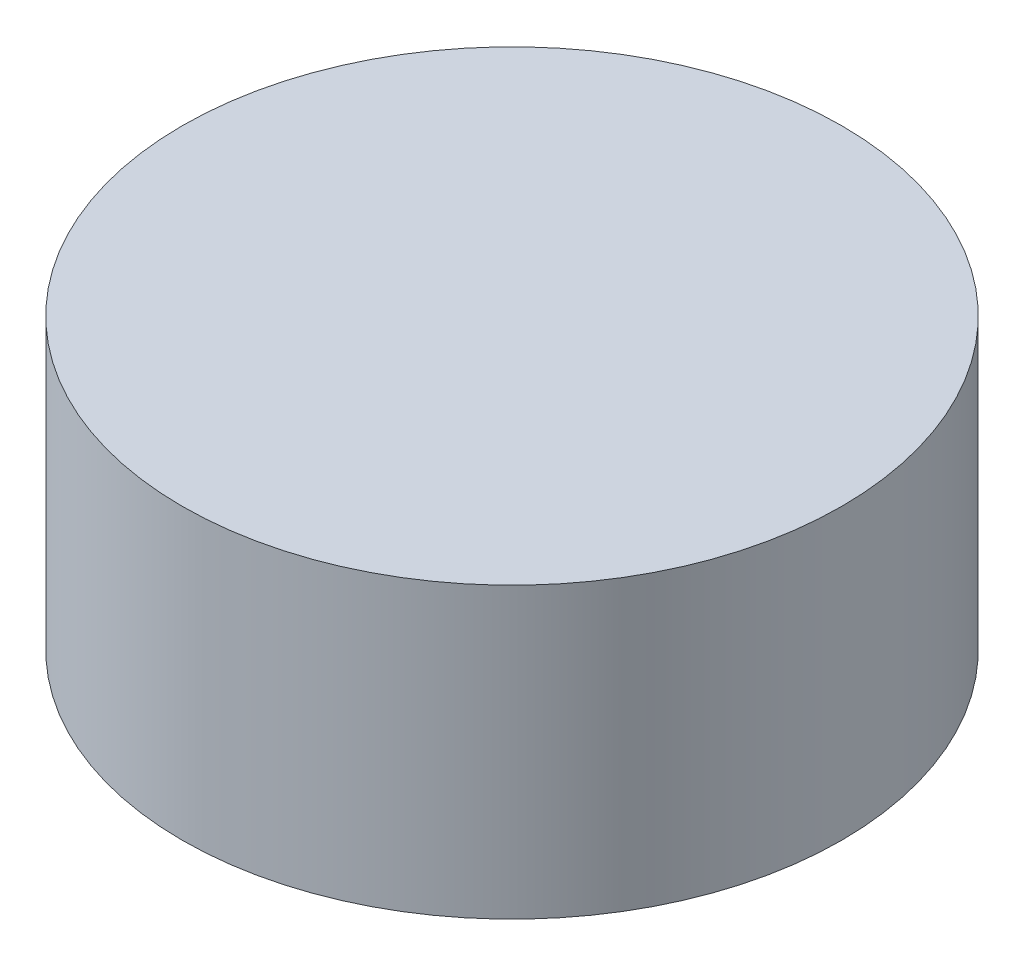
ISO-10303-21;
HEADER;
FILE_DESCRIPTION(('STEP AP214'),'2;1');
FILE_NAME('part.step','',(''),(''),'','','');
FILE_SCHEMA(('AUTOMOTIVE_DESIGN { 1 0 10303 214 1 1 1 1 }'));
ENDSEC;
DATA;
#1=APPLICATION_CONTEXT('core data for automotive mechanical design processes');
#2=APPLICATION_PROTOCOL_DEFINITION('international standard','automotive_design',2000,#1);
#3=PRODUCT_CONTEXT('',#1,'mechanical');
#4=PRODUCT('Part','Part','',(#3));
#5=PRODUCT_RELATED_PRODUCT_CATEGORY('part','',(#4));
#6=PRODUCT_DEFINITION_FORMATION('','',#4);
#7=PRODUCT_DEFINITION_CONTEXT('part definition',#1,'design');
#8=PRODUCT_DEFINITION('design','',#6,#7);
#9=PRODUCT_DEFINITION_SHAPE('','',#8);
#10=(LENGTH_UNIT() NAMED_UNIT(*) SI_UNIT(.MILLI.,.METRE.));
#11=(NAMED_UNIT(*) PLANE_ANGLE_UNIT() SI_UNIT($,.RADIAN.));
#12=(NAMED_UNIT(*) SI_UNIT($,.STERADIAN.) SOLID_ANGLE_UNIT());
#13=UNCERTAINTY_MEASURE_WITH_UNIT(LENGTH_MEASURE(1.E-05),#10,'distance_accuracy_value','');
#14=(GEOMETRIC_REPRESENTATION_CONTEXT(3) GLOBAL_UNCERTAINTY_ASSIGNED_CONTEXT((#13)) GLOBAL_UNIT_ASSIGNED_CONTEXT((#10,
#11,#12)) REPRESENTATION_CONTEXT('',''));
#15=CARTESIAN_POINT('',(0.,0.,0.));
#16=DIRECTION('',(0.,0.,1.));
#17=DIRECTION('',(1.,0.,0.));
#18=AXIS2_PLACEMENT_3D('',#15,#16,#17);
#19=CARTESIAN_POINT('',(0.,2.5,0.));
#20=DIRECTION('',(0.,-1.,0.));
#21=DIRECTION('',(0.,0.,-1.));
#22=AXIS2_PLACEMENT_3D('',#19,#20,#21);
#23=CYLINDRICAL_SURFACE('',#22,2.85);
#24=CARTESIAN_POINT('',(0.,2.5,0.));
#25=DIRECTION('',(0.,1.,0.));
#26=DIRECTION('',(0.,0.,1.));
#27=AXIS2_PLACEMENT_3D('',#24,#25,#26);
#28=CIRCLE('',#27,2.85);
#29=CARTESIAN_POINT('',(0.,2.5,2.85));
#30=VERTEX_POINT('',#29);
#31=EDGE_CURVE('E10',#30,#30,#28,.T.);
#32=ORIENTED_EDGE('',*,*,#31,.F.);
#33=EDGE_LOOP('',(#32));
#34=FACE_BOUND('',#33,.T.);
#35=CARTESIAN_POINT('',(0.,0.,0.));
#36=DIRECTION('',(0.,1.,0.));
#37=DIRECTION('',(0.,0.,1.));
#38=AXIS2_PLACEMENT_3D('',#35,#36,#37);
#39=CIRCLE('',#38,2.85);
#40=CARTESIAN_POINT('',(0.,0.,2.85));
#41=VERTEX_POINT('',#40);
#42=EDGE_CURVE('E42',#41,#41,#39,.T.);
#43=ORIENTED_EDGE('',*,*,#42,.T.);
#44=EDGE_LOOP('',(#43));
#45=FACE_BOUND('',#44,.T.);
#46=ADVANCED_FACE('F39',(#34,#45),#23,.T.);
#47=CARTESIAN_POINT('',(0.,2.5,0.));
#48=DIRECTION('',(0.,1.,0.));
#49=DIRECTION('',(0.,0.,1.));
#50=AXIS2_PLACEMENT_3D('',#47,#48,#49);
#51=PLANE('',#50);
#52=ORIENTED_EDGE('',*,*,#31,.T.);
#53=EDGE_LOOP('',(#52));
#54=FACE_BOUND('',#53,.T.);
#55=ADVANCED_FACE('F56',(#54),#51,.T.);
#56=CARTESIAN_POINT('',(0.,0.,0.));
#57=DIRECTION('',(0.,1.,0.));
#58=DIRECTION('',(0.,0.,1.));
#59=AXIS2_PLACEMENT_3D('',#56,#57,#58);
#60=PLANE('',#59);
#61=ORIENTED_EDGE('',*,*,#42,.F.);
#62=EDGE_LOOP('',(#61));
#63=FACE_BOUND('',#62,.T.);
#64=ADVANCED_FACE('F54',(#63),#60,.F.);
#65=CLOSED_SHELL('',(#46,#55,#64));
#66=MANIFOLD_SOLID_BREP('B2',#65);
#67=ADVANCED_BREP_SHAPE_REPRESENTATION('',(#18,#66),#14);
#68=SHAPE_DEFINITION_REPRESENTATION(#9,#67);
ENDSEC;
END-ISO-10303-21;
